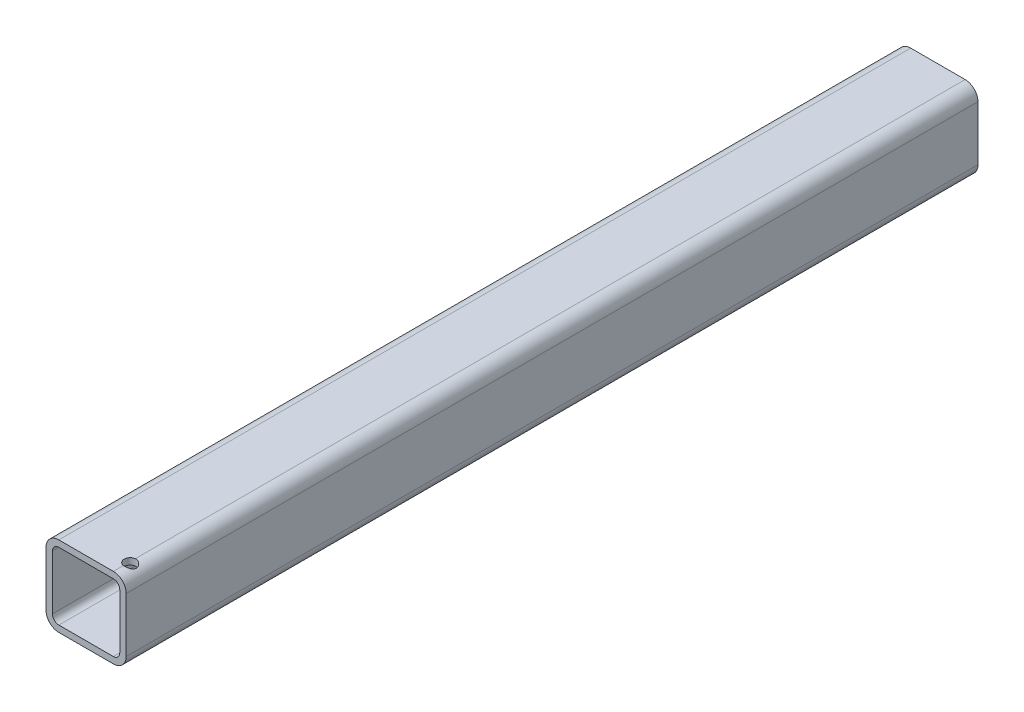
ISO-10303-21;
HEADER;
FILE_DESCRIPTION(('STEP AP214'),'2;1');
FILE_NAME('part.step','',(''),(''),'','','');
FILE_SCHEMA(('AUTOMOTIVE_DESIGN { 1 0 10303 214 1 1 1 1 }'));
ENDSEC;
DATA;
#1=APPLICATION_CONTEXT('core data for automotive mechanical design processes');
#2=APPLICATION_PROTOCOL_DEFINITION('international standard','automotive_design',2000,#1);
#3=PRODUCT_CONTEXT('',#1,'mechanical');
#4=PRODUCT('Part','Part','',(#3));
#5=PRODUCT_RELATED_PRODUCT_CATEGORY('part','',(#4));
#6=PRODUCT_DEFINITION_FORMATION('','',#4);
#7=PRODUCT_DEFINITION_CONTEXT('part definition',#1,'design');
#8=PRODUCT_DEFINITION('design','',#6,#7);
#9=PRODUCT_DEFINITION_SHAPE('','',#8);
#10=(LENGTH_UNIT() NAMED_UNIT(*) SI_UNIT(.MILLI.,.METRE.));
#11=(NAMED_UNIT(*) PLANE_ANGLE_UNIT() SI_UNIT($,.RADIAN.));
#12=(NAMED_UNIT(*) SI_UNIT($,.STERADIAN.) SOLID_ANGLE_UNIT());
#13=UNCERTAINTY_MEASURE_WITH_UNIT(LENGTH_MEASURE(1.E-05),#10,'distance_accuracy_value','');
#14=(GEOMETRIC_REPRESENTATION_CONTEXT(3) GLOBAL_UNCERTAINTY_ASSIGNED_CONTEXT((#13)) GLOBAL_UNIT_ASSIGNED_CONTEXT((#10,
#11,#12)) REPRESENTATION_CONTEXT('',''));
#15=CARTESIAN_POINT('',(0.,0.,0.));
#16=DIRECTION('',(0.,0.,1.));
#17=DIRECTION('',(1.,0.,0.));
#18=AXIS2_PLACEMENT_3D('',#15,#16,#17);
#19=CARTESIAN_POINT('',(1193.6,-1206.4,-880.000000000001));
#20=DIRECTION('',(0.,0.,1.));
#21=DIRECTION('',(1.,0.,0.));
#22=AXIS2_PLACEMENT_3D('',#19,#20,#21);
#23=CYLINDRICAL_SURFACE('',#22,3.19999999999987);
#24=CARTESIAN_POINT('',(1193.6,-1203.2,849.026786250536));
#25=CARTESIAN_POINT('',(1193.66620932112,-1203.1999842709,849.017863230513));
#26=CARTESIAN_POINT('',(1193.73271642675,-1203.20205446071,849.011182596281));
#27=CARTESIAN_POINT('',(1193.8657386283,-1203.21036120763,849.002269009164));
#28=CARTESIAN_POINT('',(1193.93225370696,-1203.21659587799,849.000034043963));
#29=CARTESIAN_POINT('',(1194.06429347108,-1203.23316690178,848.999966936365));
#30=CARTESIAN_POINT('',(1194.1298218362,-1203.24347373356,849.002103557488));
#31=CARTESIAN_POINT('',(1194.25983674047,-1203.26806759426,849.010562628987));
#32=CARTESIAN_POINT('',(1194.32432322687,-1203.28235482408,849.016885290658));
#33=CARTESIAN_POINT('',(1194.51532588333,-1203.33090239494,849.04181521872));
#34=CARTESIAN_POINT('',(1194.63969207312,-1203.37088791289,849.066385954809));
#35=CARTESIAN_POINT('',(1194.87968538173,-1203.46417382354,849.129176743057));
#36=CARTESIAN_POINT('',(1194.99529791584,-1203.51749582709,849.167418992551));
#37=CARTESIAN_POINT('',(1195.25391638054,-1203.65541724377,849.269967357924));
#38=CARTESIAN_POINT('',(1195.39277908891,-1203.74447785389,849.338714367491));
#39=CARTESIAN_POINT('',(1195.65064901229,-1203.93809496542,849.490449552845));
#40=CARTESIAN_POINT('',(1195.7696091084,-1204.04268716358,849.573470606401));
#41=CARTESIAN_POINT('',(1195.95214022795,-1204.22781491835,849.72008045974));
#42=CARTESIAN_POINT('',(1196.02113153144,-1204.30508934378,849.781190496869));
#43=CARTESIAN_POINT('',(1196.15038275712,-1204.46452039217,849.906215325151));
#44=CARTESIAN_POINT('',(1196.21064264156,-1204.54667703623,849.970130128426));
#45=CARTESIAN_POINT('',(1196.32265118066,-1204.71553028981,850.099316841432));
#46=CARTESIAN_POINT('',(1196.37440170651,-1204.80222589569,850.16458844924));
#47=CARTESIAN_POINT('',(1196.46957164095,-1204.98023125443,850.294801119524));
#48=CARTESIAN_POINT('',(1196.5129960184,-1205.07153821398,850.359742356488));
#49=CARTESIAN_POINT('',(1196.59035446715,-1205.25652688437,850.48497326175));
#50=CARTESIAN_POINT('',(1196.62454102063,-1205.35004721596,850.54534472139));
#51=CARTESIAN_POINT('',(1196.68487306557,-1205.54336957949,850.659995709951));
#52=CARTESIAN_POINT('',(1196.71102288934,-1205.64316819197,850.714278510982));
#53=CARTESIAN_POINT('',(1196.74795308368,-1205.82034595039,850.795780970688));
#54=CARTESIAN_POINT('',(1196.7609917835,-1205.89570942567,850.826267764086));
#55=CARTESIAN_POINT('',(1196.78180086415,-1206.05048607527,850.876462229913));
#56=CARTESIAN_POINT('',(1196.78959926205,-1206.12987523262,850.896227115326));
#57=CARTESIAN_POINT('',(1196.79624093164,-1206.24178783805,850.913233911294));
#58=CARTESIAN_POINT('',(1196.79764356947,-1206.27323058813,850.916856136241));
#59=CARTESIAN_POINT('',(1196.79952577223,-1206.33644222942,850.921733367001));
#60=CARTESIAN_POINT('',(1196.80000190522,-1206.36821189664,850.922979571258));
#61=CARTESIAN_POINT('',(1196.8,-1206.4,850.922967038573));
#62=B_SPLINE_CURVE_WITH_KNOTS('',3,(#24,#25,#26,#27,#28,#29,#30,#31,#32,#33,#34,#35,#36,#37,#38,
#39,#40,#41,#42,#43,#44,#45,#46,#47,#48,#49,#50,#51,#52,#53,#54,#55,#56,#57,#58,#59,#60,#61),
.UNSPECIFIED.,.F.,.F.,(4,2,2,2,2,2,2,2,2,2,2,2,2,2,2,2,2,2,4),(0.,0.200346249189459,
0.400601791621769,0.599431437533845,0.798271120380716,1.19503508074588,1.59244618252766,
2.12568925794377,2.66017743562007,3.02056841165416,3.38096094539118,3.7412741232959,
4.10137160032824,4.450305339861,4.79905065105189,5.04544975439357,5.29052078480764,
5.38547313309838,5.4807765376363),.UNSPECIFIED.);
#63=CARTESIAN_POINT('',(1193.6,-1203.2,849.026786250536));
#64=VERTEX_POINT('',#63);
#65=CARTESIAN_POINT('',(1196.8,-1206.4,850.922967038573));
#66=VERTEX_POINT('',#65);
#67=EDGE_CURVE('E195',#64,#66,#62,.T.);
#68=ORIENTED_EDGE('',*,*,#67,.F.);
#69=DIRECTION('',(0.,0.,1.));
#70=VECTOR('',#69,1.);
#71=CARTESIAN_POINT('',(1193.6,-1203.2,-880.000000000001));
#72=LINE('',#71,#70);
#73=CARTESIAN_POINT('',(1193.6,-1203.2,435.));
#74=VERTEX_POINT('',#73);
#75=EDGE_CURVE('E287',#74,#64,#72,.T.);
#76=ORIENTED_EDGE('',*,*,#75,.F.);
#77=CARTESIAN_POINT('',(1193.6,-1206.4,435.));
#78=DIRECTION('',(0.,0.,1.));
#79=DIRECTION('',(1.,0.,0.));
#80=AXIS2_PLACEMENT_3D('',#77,#78,#79);
#81=CIRCLE('',#80,3.19999999999987);
#82=CARTESIAN_POINT('',(1196.8,-1206.4,435.));
#83=VERTEX_POINT('',#82);
#84=EDGE_CURVE('E215',#74,#83,#81,.F.);
#85=ORIENTED_EDGE('',*,*,#84,.T.);
#86=DIRECTION('',(0.,0.,1.));
#87=VECTOR('',#86,1.);
#88=CARTESIAN_POINT('',(1196.8,-1206.4,-880.000000000001));
#89=LINE('',#88,#87);
#90=EDGE_CURVE('E286',#66,#83,#89,.F.);
#91=ORIENTED_EDGE('',*,*,#90,.F.);
#92=EDGE_LOOP('',(#68,#76,#85,#91));
#93=FACE_BOUND('',#92,.T.);
#94=ADVANCED_FACE('F16',(#93),#23,.F.);
#95=CARTESIAN_POINT('',(1196.8,-1206.4,853.077032961427));
#96=CARTESIAN_POINT('',(1196.80000975725,-1206.35649191912,853.076977904457));
#97=CARTESIAN_POINT('',(1196.79911274527,-1206.31304131853,853.079340153122));
#98=CARTESIAN_POINT('',(1196.79559845224,-1206.22682632019,853.088425169337));
#99=CARTESIAN_POINT('',(1196.7929876315,-1206.18405996089,853.095131560098));
#100=CARTESIAN_POINT('',(1196.78285476501,-1206.05890217577,853.120731430081));
#101=CARTESIAN_POINT('',(1196.77302393382,-1205.97782262805,853.145144890022));
#102=CARTESIAN_POINT('',(1196.75053700525,-1205.83586704505,853.197997314719));
#103=CARTESIAN_POINT('',(1196.73881058255,-1205.77414286308,853.22471295204));
#104=CARTESIAN_POINT('',(1196.71228890266,-1205.65335751336,853.282379867236));
#105=CARTESIAN_POINT('',(1196.69749165706,-1205.59429810142,853.313333885104));
#106=CARTESIAN_POINT('',(1196.66484342788,-1205.47780521208,853.378387249168));
#107=CARTESIAN_POINT('',(1196.64695610463,-1205.42040184424,853.412521498987));
#108=CARTESIAN_POINT('',(1196.60837370353,-1205.30764716312,853.482562026696));
#109=CARTESIAN_POINT('',(1196.58767775257,-1205.2522964948,853.518468853403));
#110=CARTESIAN_POINT('',(1196.52549317625,-1205.09888062393,853.621065711078));
#111=CARTESIAN_POINT('',(1196.48083382284,-1205.00287301641,853.688932711131));
#112=CARTESIAN_POINT('',(1196.38241905077,-1204.81592473061,853.825149178094));
#113=CARTESIAN_POINT('',(1196.32865757332,-1204.72498748135,853.893498937118));
#114=CARTESIAN_POINT('',(1196.21210875149,-1204.54851066083,854.028419134489));
#115=CARTESIAN_POINT('',(1196.14936473817,-1204.46294786196,854.094996392561));
#116=CARTESIAN_POINT('',(1196.01444237507,-1204.29717355675,854.225039523954));
#117=CARTESIAN_POINT('',(1195.94227007044,-1204.21695867086,854.288507355393));
#118=CARTESIAN_POINT('',(1195.75953760893,-1204.03382473803,854.433563737396));
#119=CARTESIAN_POINT('',(1195.64466964804,-1203.93352384094,854.51313887678));
#120=CARTESIAN_POINT('',(1195.39634479866,-1203.74723713651,854.659117037007));
#121=CARTESIAN_POINT('',(1195.26290671037,-1203.66123704209,854.725533217047));
#122=CARTESIAN_POINT('',(1195.00557001958,-1203.52223540611,854.829181061504));
#123=CARTESIAN_POINT('',(1194.88466051412,-1203.46606887535,854.869558661143));
#124=CARTESIAN_POINT('',(1194.63323699235,-1203.36841760611,854.935265842734));
#125=CARTESIAN_POINT('',(1194.50274234969,-1203.32690418609,854.960624888252));
#126=CARTESIAN_POINT('',(1194.30684940784,-1203.2783784662,854.984931862962));
#127=CARTESIAN_POINT('',(1194.24383015084,-1203.26477101025,854.990752663502));
#128=CARTESIAN_POINT('',(1194.11683659648,-1203.24135476926,854.998397484813));
#129=CARTESIAN_POINT('',(1194.05286239069,-1203.23154562235,855.000221886393));
#130=CARTESIAN_POINT('',(1193.92401886946,-1203.21578126698,854.999733585524));
#131=CARTESIAN_POINT('',(1193.85914642629,-1203.20985259476,854.997392795943));
#132=CARTESIAN_POINT('',(1193.72942158505,-1203.20195400469,854.988484227468));
#133=CARTESIAN_POINT('',(1193.66456920936,-1203.19998588047,854.98191453517));
#134=CARTESIAN_POINT('',(1193.6,-1203.2,854.973213749464));
#135=B_SPLINE_CURVE_WITH_KNOTS('',3,(#95,#96,#97,#98,#99,#100,#101,#102,#103,#104,#105,#106,
#107,#108,#109,#110,#111,#112,#113,#114,#115,#116,#117,#118,#119,#120,#121,#122,#123,#124,#125,
#126,#127,#128,#129,#130,#131,#132,#133,#134),.UNSPECIFIED.,.F.,.F.,(4,2,2,2,2,2,2,2,2,2,2,2,2,
2,2,2,2,2,2,4),(0.,0.130354585073929,0.260220589825742,0.514569593691118,0.71913243189332,
0.92382814417263,1.13111920045024,1.33847484463474,1.71528091036408,2.09233878801075,
2.46763549750819,2.84269274856531,3.35690170495937,3.87059381851075,4.28687827567049,
4.70234333257934,4.89634698677732,5.09033215397543,5.28563038268798,5.48101703802198),.UNSPECIFIED.);
#136=CARTESIAN_POINT('',(1196.8,-1206.4,853.077032961427));
#137=VERTEX_POINT('',#136);
#138=CARTESIAN_POINT('',(1193.6,-1203.2,854.973213749464));
#139=VERTEX_POINT('',#138);
#140=EDGE_CURVE('E165',#137,#139,#135,.T.);
#141=ORIENTED_EDGE('',*,*,#140,.F.);
#142=CARTESIAN_POINT('',(1196.8,-1206.4,860.));
#143=VERTEX_POINT('',#142);
#144=EDGE_CURVE('E164',#143,#137,#89,.F.);
#145=ORIENTED_EDGE('',*,*,#144,.F.);
#146=CARTESIAN_POINT('',(1193.6,-1206.4,860.));
#147=DIRECTION('',(0.,0.,1.));
#148=DIRECTION('',(1.,0.,0.));
#149=AXIS2_PLACEMENT_3D('',#146,#147,#148);
#150=CIRCLE('',#149,3.19999999999987);
#151=CARTESIAN_POINT('',(1193.6,-1203.2,860.));
#152=VERTEX_POINT('',#151);
#153=EDGE_CURVE('E255',#152,#143,#150,.F.);
#154=ORIENTED_EDGE('',*,*,#153,.F.);
#155=EDGE_CURVE('E290',#139,#152,#72,.T.);
#156=ORIENTED_EDGE('',*,*,#155,.F.);
#157=EDGE_LOOP('',(#141,#145,#154,#156));
#158=FACE_BOUND('',#157,.T.);
#159=ADVANCED_FACE('F374',(#158),#23,.F.);
#160=CARTESIAN_POINT('',(1196.8,-1233.6,-880.000000000001));
#161=DIRECTION('',(-1.,0.,0.));
#162=DIRECTION('',(0.,-1.,0.));
#163=AXIS2_PLACEMENT_3D('',#160,#161,#162);
#164=PLANE('',#163);
#165=DIRECTION('',(0.,0.,-1.));
#166=VECTOR('',#165,1.);
#167=CARTESIAN_POINT('',(1196.8,-1210.,-880.000000000001));
#168=LINE('',#167,#166);
#169=CARTESIAN_POINT('',(1196.8,-1210.,853.077032961427));
#170=VERTEX_POINT('',#169);
#171=CARTESIAN_POINT('',(1196.8,-1210.,850.922967038573));
#172=VERTEX_POINT('',#171);
#173=EDGE_CURVE('E11',#170,#172,#168,.T.);
#174=ORIENTED_EDGE('',*,*,#173,.T.);
#175=DIRECTION('',(0.,-1.,0.));
#176=VECTOR('',#175,1.);
#177=CARTESIAN_POINT('',(1196.8,-745.,850.922967038573));
#178=LINE('',#177,#176);
#179=EDGE_CURVE('E158',#172,#66,#178,.F.);
#180=ORIENTED_EDGE('',*,*,#179,.T.);
#181=ORIENTED_EDGE('',*,*,#90,.T.);
#182=DIRECTION('',(0.,1.,0.));
#183=VECTOR('',#182,1.);
#184=CARTESIAN_POINT('',(1196.8,-1235.4,435.));
#185=LINE('',#184,#183);
#186=CARTESIAN_POINT('',(1196.8,-1233.6,435.));
#187=VERTEX_POINT('',#186);
#188=EDGE_CURVE('E212',#83,#187,#185,.F.);
#189=ORIENTED_EDGE('',*,*,#188,.T.);
#190=DIRECTION('',(0.,0.,1.));
#191=VECTOR('',#190,1.);
#192=CARTESIAN_POINT('',(1196.8,-1233.6,-880.000000000001));
#193=LINE('',#192,#191);
#194=CARTESIAN_POINT('',(1196.8,-1233.6,860.));
#195=VERTEX_POINT('',#194);
#196=EDGE_CURVE('E282',#187,#195,#193,.T.);
#197=ORIENTED_EDGE('',*,*,#196,.T.);
#198=DIRECTION('',(0.,1.,0.));
#199=VECTOR('',#198,1.);
#200=CARTESIAN_POINT('',(1196.8,-1206.4,860.));
#201=LINE('',#200,#199);
#202=EDGE_CURVE('E253',#143,#195,#201,.F.);
#203=ORIENTED_EDGE('',*,*,#202,.F.);
#204=ORIENTED_EDGE('',*,*,#144,.T.);
#205=DIRECTION('',(0.,-1.,0.));
#206=VECTOR('',#205,1.);
#207=CARTESIAN_POINT('',(1196.8,-745.,853.077032961427));
#208=LINE('',#207,#206);
#209=EDGE_CURVE('E156',#137,#170,#208,.T.);
#210=ORIENTED_EDGE('',*,*,#209,.T.);
#211=EDGE_LOOP('',(#174,#180,#181,#189,#197,#203,#204,#210));
#212=FACE_BOUND('',#211,.T.);
#213=ADVANCED_FACE('F161',(#212),#164,.T.);
#214=CARTESIAN_POINT('',(1193.6,-1206.4,-880.000000000001));
#215=DIRECTION('',(0.,0.,1.));
#216=DIRECTION('',(1.,0.,0.));
#217=AXIS2_PLACEMENT_3D('',#214,#215,#216);
#218=CYLINDRICAL_SURFACE('',#217,6.39999999999996);
#219=DIRECTION('',(0.,0.,1.));
#220=VECTOR('',#219,1.);
#221=CARTESIAN_POINT('',(1193.6,-1200.,-880.000000000001));
#222=LINE('',#221,#220);
#223=CARTESIAN_POINT('',(1193.6,-1200.,435.));
#224=VERTEX_POINT('',#223);
#225=CARTESIAN_POINT('',(1193.6,-1200.,849.026786250536));
#226=VERTEX_POINT('',#225);
#227=EDGE_CURVE('E242',#224,#226,#222,.T.);
#228=ORIENTED_EDGE('',*,*,#227,.T.);
#229=CARTESIAN_POINT('',(1193.6,-1200.,849.026786250536));
#230=CARTESIAN_POINT('',(1193.67819963284,-1199.99998680551,849.016253378908));
#231=CARTESIAN_POINT('',(1193.75681301825,-1200.00143291347,849.00883029324));
#232=CARTESIAN_POINT('',(1193.91425259596,-1200.0072381012,849.000192976679));
#233=CARTESIAN_POINT('',(1193.99307872658,-1200.01159641184,848.998977107112));
#234=CARTESIAN_POINT('',(1194.15005455485,-1200.0231969838,849.002730390493));
#235=CARTESIAN_POINT('',(1194.22820569805,-1200.03042757,849.007674675594));
#236=CARTESIAN_POINT('',(1194.38356171304,-1200.04766562412,849.023595087985));
#237=CARTESIAN_POINT('',(1194.4607665637,-1200.05767315394,849.034571349764));
#238=CARTESIAN_POINT('',(1194.69005854621,-1200.0916299009,849.076323289101));
#239=CARTESIAN_POINT('',(1194.84005812921,-1200.11953118753,849.1159284055));
#240=CARTESIAN_POINT('',(1195.13053878312,-1200.18391757282,849.216907584853));
#241=CARTESIAN_POINT('',(1195.27101259469,-1200.22040912528,849.278298032618));
#242=CARTESIAN_POINT('',(1195.54621998598,-1200.30133069995,849.424225785717));
#243=CARTESIAN_POINT('',(1195.68034745487,-1200.34605928155,849.509738889701));
#244=CARTESIAN_POINT('',(1195.93282292561,-1200.43878665143,849.700167182546));
#245=CARTESIAN_POINT('',(1196.051160809,-1200.48678750721,849.805094710978));
#246=CARTESIAN_POINT('',(1196.28064730267,-1200.58697365739,850.043318260197));
#247=CARTESIAN_POINT('',(1196.38999081455,-1200.63911417118,850.178377241175));
#248=CARTESIAN_POINT('',(1196.58461458652,-1200.73749174168,850.467028731662));
#249=CARTESIAN_POINT('',(1196.66989191021,-1200.78372807763,850.620623499515));
#250=CARTESIAN_POINT('',(1196.77684605295,-1200.84398530065,850.861255296663));
#251=CARTESIAN_POINT('',(1196.80888443298,-1200.86247788349,850.942698735273));
#252=CARTESIAN_POINT('',(1196.86588552342,-1200.89590294115,851.108715634963));
#253=CARTESIAN_POINT('',(1196.89085221952,-1200.91083742062,851.193287302419));
#254=CARTESIAN_POINT('',(1196.93331152558,-1200.93651656695,851.364798457377));
#255=CARTESIAN_POINT('',(1196.95081327669,-1200.94726635675,851.451734909446));
#256=CARTESIAN_POINT('',(1196.97807707545,-1200.96411414238,851.627255213176));
#257=CARTESIAN_POINT('',(1196.98784061056,-1200.97021303222,851.715838744881));
#258=CARTESIAN_POINT('',(1196.99861408461,-1200.97695163865,851.881022722217));
#259=CARTESIAN_POINT('',(1197.00067396207,-1200.97824594778,851.957530152901));
#260=CARTESIAN_POINT('',(1196.99894059038,-1200.97715899558,852.110478833258));
#261=CARTESIAN_POINT('',(1196.99514551235,-1200.97477658578,852.186920054786));
#262=CARTESIAN_POINT('',(1196.9817544563,-1200.96641929891,852.339071167859));
#263=CARTESIAN_POINT('',(1196.97216025407,-1200.96044552158,852.414781276074));
#264=CARTESIAN_POINT('',(1196.94731315016,-1200.94512116733,852.56493022428));
#265=CARTESIAN_POINT('',(1196.9320580068,-1200.93576925274,852.639368548423));
#266=CARTESIAN_POINT('',(1196.88003211932,-1200.90427449946,852.851978616068));
#267=CARTESIAN_POINT('',(1196.8361964791,-1200.87815565623,852.987905756417));
#268=CARTESIAN_POINT('',(1196.73062186692,-1200.81762784134,853.250516351857));
#269=CARTESIAN_POINT('',(1196.66887774692,-1200.78321648638,853.377197135832));
#270=CARTESIAN_POINT('',(1196.52096123889,-1200.70475842104,853.633755617671));
#271=CARTESIAN_POINT('',(1196.43277578275,-1200.66005540323,853.762272754726));
#272=CARTESIAN_POINT('',(1196.23816173528,-1200.56804576061,854.003672377652));
#273=CARTESIAN_POINT('',(1196.13171992221,-1200.52073726584,854.11654342434));
#274=CARTESIAN_POINT('',(1195.88853445657,-1200.42154914935,854.337433167327));
#275=CARTESIAN_POINT('',(1195.749681743,-1200.36981051695,854.443205397736));
#276=CARTESIAN_POINT('',(1195.45402269376,-1200.27246145445,854.629888123971));
#277=CARTESIAN_POINT('',(1195.29721609801,-1200.22685111312,854.710798259576));
#278=CARTESIAN_POINT('',(1195.05302402502,-1200.16656959876,854.810468085302));
#279=CARTESIAN_POINT('',(1194.97083427747,-1200.14795094798,854.839921207682));
#280=CARTESIAN_POINT('',(1194.80365684132,-1200.11362827825,854.89167379568));
#281=CARTESIAN_POINT('',(1194.71867058201,-1200.09792279681,854.913976854946));
#282=CARTESIAN_POINT('',(1194.54666136581,-1200.06980092576,854.951083679122));
#283=CARTESIAN_POINT('',(1194.45964116204,-1200.05738034188,854.965897029417));
#284=CARTESIAN_POINT('',(1194.28424532208,-1200.03606959428,854.987810462644));
#285=CARTESIAN_POINT('',(1194.19587038862,-1200.0271776605,854.994914415905));
#286=CARTESIAN_POINT('',(1194.02266022304,-1200.01340958426,855.001106091609));
#287=CARTESIAN_POINT('',(1193.93785086866,-1200.00836635429,855.000550239218));
#288=CARTESIAN_POINT('',(1193.76853541111,-1200.00165425474,854.992261366149));
#289=CARTESIAN_POINT('',(1193.68402908982,-1199.99998202423,854.984535505322));
#290=CARTESIAN_POINT('',(1193.6,-1200.,854.973213749464));
#291=B_SPLINE_CURVE_WITH_KNOTS('',3,(#229,#230,#231,#232,#233,#234,#235,#236,#237,#238,#239,
#240,#241,#242,#243,#244,#245,#246,#247,#248,#249,#250,#251,#252,#253,#254,#255,#256,#257,#258,
#259,#260,#261,#262,#263,#264,#265,#266,#267,#268,#269,#270,#271,#272,#273,#274,#275,#276,#277,
#278,#279,#280,#281,#282,#283,#284,#285,#286,#287,#288,#289,#290),.UNSPECIFIED.,.F.,.F.,(4,2,2,
2,2,2,2,2,2,2,2,2,2,2,2,2,2,2,2,2,2,2,2,2,2,2,2,2,2,2,4),(0.,0.236633858176166,0.47320524294034,
0.708824702584138,0.944449415767854,1.4150005113405,1.88590626246263,2.37958473715969,
2.87357807249905,3.4153952535362,3.95727851468552,4.22529831819561,4.49316676026505,
4.76070623732625,5.02819427504094,5.25752889028156,5.48693515610299,5.7162712098299,
5.94569817609626,6.37933098803909,6.81308857736806,7.29760345495907,7.78247072396151,
8.32610915231289,8.86975545695923,9.13725653104721,9.40462294651947,9.67164631276838,
9.93853556389711,10.1930496212096,10.4473097981923),.UNSPECIFIED.);
#292=CARTESIAN_POINT('',(1193.6,-1200.,854.973213749464));
#293=VERTEX_POINT('',#292);
#294=EDGE_CURVE('E24',#226,#293,#291,.T.);
#295=ORIENTED_EDGE('',*,*,#294,.T.);
#296=CARTESIAN_POINT('',(1193.6,-1200.,860.));
#297=VERTEX_POINT('',#296);
#298=EDGE_CURVE('E245',#293,#297,#222,.T.);
#299=ORIENTED_EDGE('',*,*,#298,.T.);
#300=CARTESIAN_POINT('',(1193.6,-1206.4,860.));
#301=DIRECTION('',(0.,0.,1.));
#302=DIRECTION('',(1.,0.,0.));
#303=AXIS2_PLACEMENT_3D('',#300,#301,#302);
#304=CIRCLE('',#303,6.39999999999996);
#305=CARTESIAN_POINT('',(1200.,-1206.4,860.));
#306=VERTEX_POINT('',#305);
#307=EDGE_CURVE('E251',#297,#306,#304,.F.);
#308=ORIENTED_EDGE('',*,*,#307,.T.);
#309=DIRECTION('',(0.,0.,1.));
#310=VECTOR('',#309,1.);
#311=CARTESIAN_POINT('',(1200.,-1206.4,-880.000000000001));
#312=LINE('',#311,#310);
#313=CARTESIAN_POINT('',(1200.,-1206.4,435.));
#314=VERTEX_POINT('',#313);
#315=EDGE_CURVE('E233',#306,#314,#312,.F.);
#316=ORIENTED_EDGE('',*,*,#315,.T.);
#317=CARTESIAN_POINT('',(1193.6,-1206.4,435.));
#318=DIRECTION('',(0.,0.,1.));
#319=DIRECTION('',(1.,0.,0.));
#320=AXIS2_PLACEMENT_3D('',#317,#318,#319);
#321=CIRCLE('',#320,6.39999999999996);
#322=EDGE_CURVE('E232',#314,#224,#321,.T.);
#323=ORIENTED_EDGE('',*,*,#322,.T.);
#324=EDGE_LOOP('',(#228,#295,#299,#308,#316,#323));
#325=FACE_BOUND('',#324,.T.);
#326=ADVANCED_FACE('F357',(#325),#218,.T.);
#327=CARTESIAN_POINT('',(1166.4,-1200.,-880.000000000001));
#328=DIRECTION('',(0.,-1.,0.));
#329=DIRECTION('',(1.,0.,0.));
#330=AXIS2_PLACEMENT_3D('',#327,#328,#329);
#331=PLANE('',#330);
#332=CARTESIAN_POINT('',(1194.,-1200.,852.));
#333=DIRECTION('',(0.,-1.,0.));
#334=DIRECTION('',(1.,0.,0.));
#335=AXIS2_PLACEMENT_3D('',#332,#333,#334);
#336=CIRCLE('',#335,2.99999999999994);
#337=EDGE_CURVE('E37',#226,#293,#336,.F.);
#338=ORIENTED_EDGE('',*,*,#337,.F.);
#339=ORIENTED_EDGE('',*,*,#227,.F.);
#340=DIRECTION('',(1.,0.,0.));
#341=VECTOR('',#340,1.);
#342=CARTESIAN_POINT('',(1164.6,-1200.,435.));
#343=LINE('',#342,#341);
#344=CARTESIAN_POINT('',(1166.4,-1200.,435.));
#345=VERTEX_POINT('',#344);
#346=EDGE_CURVE('E229',#224,#345,#343,.F.);
#347=ORIENTED_EDGE('',*,*,#346,.T.);
#348=DIRECTION('',(0.,0.,1.));
#349=VECTOR('',#348,1.);
#350=CARTESIAN_POINT('',(1166.4,-1200.,-880.));
#351=LINE('',#350,#349);
#352=CARTESIAN_POINT('',(1166.4,-1200.,860.));
#353=VERTEX_POINT('',#352);
#354=EDGE_CURVE('E202',#353,#345,#351,.F.);
#355=ORIENTED_EDGE('',*,*,#354,.F.);
#356=DIRECTION('',(1.,0.,0.));
#357=VECTOR('',#356,1.);
#358=CARTESIAN_POINT('',(1180.,-1200.,860.));
#359=LINE('',#358,#357);
#360=EDGE_CURVE('E271',#297,#353,#359,.F.);
#361=ORIENTED_EDGE('',*,*,#360,.F.);
#362=ORIENTED_EDGE('',*,*,#298,.F.);
#363=EDGE_LOOP('',(#338,#339,#347,#355,#361,#362));
#364=FACE_BOUND('',#363,.T.);
#365=ADVANCED_FACE('F18',(#364),#331,.F.);
#366=CARTESIAN_POINT('',(1166.4,-1206.4,-880.));
#367=DIRECTION('',(0.,0.,1.));
#368=DIRECTION('',(1.,0.,0.));
#369=AXIS2_PLACEMENT_3D('',#366,#367,#368);
#370=CYLINDRICAL_SURFACE('',#369,6.39999999999996);
#371=ORIENTED_EDGE('',*,*,#354,.T.);
#372=CARTESIAN_POINT('',(1166.4,-1206.4,435.));
#373=DIRECTION('',(0.,0.,1.));
#374=DIRECTION('',(1.,0.,0.));
#375=AXIS2_PLACEMENT_3D('',#372,#373,#374);
#376=CIRCLE('',#375,6.39999999999996);
#377=CARTESIAN_POINT('',(1160.,-1206.4,435.));
#378=VERTEX_POINT('',#377);
#379=EDGE_CURVE('E228',#345,#378,#376,.T.);
#380=ORIENTED_EDGE('',*,*,#379,.T.);
#381=DIRECTION('',(0.,0.,1.));
#382=VECTOR('',#381,1.);
#383=CARTESIAN_POINT('',(1160.,-1206.4,-880.000000000001));
#384=LINE('',#383,#382);
#385=CARTESIAN_POINT('',(1160.,-1206.4,860.));
#386=VERTEX_POINT('',#385);
#387=EDGE_CURVE('E299',#378,#386,#384,.T.);
#388=ORIENTED_EDGE('',*,*,#387,.T.);
#389=CARTESIAN_POINT('',(1166.4,-1206.4,860.));
#390=DIRECTION('',(0.,0.,1.));
#391=DIRECTION('',(1.,0.,0.));
#392=AXIS2_PLACEMENT_3D('',#389,#390,#391);
#393=CIRCLE('',#392,6.39999999999996);
#394=EDGE_CURVE('E270',#353,#386,#393,.T.);
#395=ORIENTED_EDGE('',*,*,#394,.F.);
#396=EDGE_LOOP('',(#371,#380,#388,#395));
#397=FACE_BOUND('',#396,.T.);
#398=ADVANCED_FACE('F334',(#397),#370,.T.);
#399=CARTESIAN_POINT('',(1160.,-1206.4,-880.000000000001));
#400=DIRECTION('',(1.,0.,0.));
#401=DIRECTION('',(0.,1.,0.));
#402=AXIS2_PLACEMENT_3D('',#399,#400,#401);
#403=PLANE('',#402);
#404=DIRECTION('',(0.,0.,1.));
#405=VECTOR('',#404,1.);
#406=CARTESIAN_POINT('',(1160.,-1233.6,-880.000000000001));
#407=LINE('',#406,#405);
#408=CARTESIAN_POINT('',(1160.,-1233.6,860.));
#409=VERTEX_POINT('',#408);
#410=CARTESIAN_POINT('',(1160.,-1233.6,435.));
#411=VERTEX_POINT('',#410);
#412=EDGE_CURVE('E297',#409,#411,#407,.F.);
#413=ORIENTED_EDGE('',*,*,#412,.F.);
#414=DIRECTION('',(0.,1.,0.));
#415=VECTOR('',#414,1.);
#416=CARTESIAN_POINT('',(1160.,-1206.4,860.));
#417=LINE('',#416,#415);
#418=EDGE_CURVE('E268',#386,#409,#417,.F.);
#419=ORIENTED_EDGE('',*,*,#418,.F.);
#420=ORIENTED_EDGE('',*,*,#387,.F.);
#421=DIRECTION('',(0.,1.,0.));
#422=VECTOR('',#421,1.);
#423=CARTESIAN_POINT('',(1160.,-1235.4,435.));
#424=LINE('',#423,#422);
#425=EDGE_CURVE('E225',#378,#411,#424,.F.);
#426=ORIENTED_EDGE('',*,*,#425,.T.);
#427=EDGE_LOOP('',(#413,#419,#420,#426));
#428=FACE_BOUND('',#427,.T.);
#429=ADVANCED_FACE('F338',(#428),#403,.F.);
#430=CARTESIAN_POINT('',(1166.4,-1233.6,-880.000000000001));
#431=DIRECTION('',(0.,0.,1.));
#432=DIRECTION('',(1.,0.,0.));
#433=AXIS2_PLACEMENT_3D('',#430,#431,#432);
#434=CYLINDRICAL_SURFACE('',#433,6.39999999999996);
#435=ORIENTED_EDGE('',*,*,#412,.T.);
#436=CARTESIAN_POINT('',(1166.4,-1233.6,435.));
#437=DIRECTION('',(0.,0.,1.));
#438=DIRECTION('',(1.,0.,0.));
#439=AXIS2_PLACEMENT_3D('',#436,#437,#438);
#440=CIRCLE('',#439,6.39999999999996);
#441=CARTESIAN_POINT('',(1166.4,-1240.,435.));
#442=VERTEX_POINT('',#441);
#443=EDGE_CURVE('E224',#411,#442,#440,.T.);
#444=ORIENTED_EDGE('',*,*,#443,.T.);
#445=DIRECTION('',(0.,0.,1.));
#446=VECTOR('',#445,1.);
#447=CARTESIAN_POINT('',(1166.4,-1240.,-880.000000000001));
#448=LINE('',#447,#446);
#449=CARTESIAN_POINT('',(1166.4,-1240.,860.));
#450=VERTEX_POINT('',#449);
#451=EDGE_CURVE('E293',#442,#450,#448,.T.);
#452=ORIENTED_EDGE('',*,*,#451,.T.);
#453=CARTESIAN_POINT('',(1166.4,-1233.6,860.));
#454=DIRECTION('',(0.,0.,1.));
#455=DIRECTION('',(1.,0.,0.));
#456=AXIS2_PLACEMENT_3D('',#453,#454,#455);
#457=CIRCLE('',#456,6.39999999999996);
#458=EDGE_CURVE('E267',#409,#450,#457,.T.);
#459=ORIENTED_EDGE('',*,*,#458,.F.);
#460=EDGE_LOOP('',(#435,#444,#452,#459));
#461=FACE_BOUND('',#460,.T.);
#462=ADVANCED_FACE('F342',(#461),#434,.T.);
#463=CARTESIAN_POINT('',(1193.6,-1240.,-880.000000000001));
#464=DIRECTION('',(0.,1.,0.));
#465=DIRECTION('',(-1.,0.,0.));
#466=AXIS2_PLACEMENT_3D('',#463,#464,#465);
#467=PLANE('',#466);
#468=DIRECTION('',(0.,0.,1.));
#469=VECTOR('',#468,1.);
#470=CARTESIAN_POINT('',(1193.6,-1240.,-880.000000000001));
#471=LINE('',#470,#469);
#472=CARTESIAN_POINT('',(1193.6,-1240.,860.));
#473=VERTEX_POINT('',#472);
#474=CARTESIAN_POINT('',(1193.6,-1240.,435.));
#475=VERTEX_POINT('',#474);
#476=EDGE_CURVE('E273',#473,#475,#471,.F.);
#477=ORIENTED_EDGE('',*,*,#476,.F.);
#478=DIRECTION('',(1.,0.,0.));
#479=VECTOR('',#478,1.);
#480=CARTESIAN_POINT('',(1180.,-1240.,860.));
#481=LINE('',#480,#479);
#482=EDGE_CURVE('E264',#450,#473,#481,.T.);
#483=ORIENTED_EDGE('',*,*,#482,.F.);
#484=ORIENTED_EDGE('',*,*,#451,.F.);
#485=DIRECTION('',(1.,0.,0.));
#486=VECTOR('',#485,1.);
#487=CARTESIAN_POINT('',(1164.6,-1240.,435.));
#488=LINE('',#487,#486);
#489=EDGE_CURVE('E220',#442,#475,#488,.T.);
#490=ORIENTED_EDGE('',*,*,#489,.T.);
#491=EDGE_LOOP('',(#477,#483,#484,#490));
#492=FACE_BOUND('',#491,.T.);
#493=ADVANCED_FACE('F348',(#492),#467,.F.);
#494=CARTESIAN_POINT('',(1166.4,-1206.4,-880.));
#495=DIRECTION('',(0.,0.,1.));
#496=DIRECTION('',(1.,0.,0.));
#497=AXIS2_PLACEMENT_3D('',#494,#495,#496);
#498=CYLINDRICAL_SURFACE('',#497,3.19999999999987);
#499=CARTESIAN_POINT('',(1166.4,-1206.4,860.));
#500=DIRECTION('',(0.,0.,1.));
#501=DIRECTION('',(1.,0.,0.));
#502=AXIS2_PLACEMENT_3D('',#499,#500,#501);
#503=CIRCLE('',#502,3.19999999999987);
#504=CARTESIAN_POINT('',(1163.2,-1206.4,860.));
#505=VERTEX_POINT('',#504);
#506=CARTESIAN_POINT('',(1166.4,-1203.2,860.));
#507=VERTEX_POINT('',#506);
#508=EDGE_CURVE('E259',#505,#507,#503,.F.);
#509=ORIENTED_EDGE('',*,*,#508,.F.);
#510=DIRECTION('',(0.,0.,1.));
#511=VECTOR('',#510,1.);
#512=CARTESIAN_POINT('',(1163.2,-1206.4,-880.000000000001));
#513=LINE('',#512,#511);
#514=CARTESIAN_POINT('',(1163.2,-1206.4,435.));
#515=VERTEX_POINT('',#514);
#516=EDGE_CURVE('E276',#515,#505,#513,.T.);
#517=ORIENTED_EDGE('',*,*,#516,.F.);
#518=CARTESIAN_POINT('',(1166.4,-1206.4,435.));
#519=DIRECTION('',(0.,0.,1.));
#520=DIRECTION('',(1.,0.,0.));
#521=AXIS2_PLACEMENT_3D('',#518,#519,#520);
#522=CIRCLE('',#521,3.19999999999987);
#523=CARTESIAN_POINT('',(1166.4,-1203.2,435.));
#524=VERTEX_POINT('',#523);
#525=EDGE_CURVE('E219',#515,#524,#522,.F.);
#526=ORIENTED_EDGE('',*,*,#525,.T.);
#527=DIRECTION('',(0.,0.,1.));
#528=VECTOR('',#527,1.);
#529=CARTESIAN_POINT('',(1166.4,-1203.2,-880.000000000001));
#530=LINE('',#529,#528);
#531=EDGE_CURVE('E291',#507,#524,#530,.F.);
#532=ORIENTED_EDGE('',*,*,#531,.F.);
#533=EDGE_LOOP('',(#509,#517,#526,#532));
#534=FACE_BOUND('',#533,.T.);
#535=ADVANCED_FACE('F395',(#534),#498,.F.);
#536=CARTESIAN_POINT('',(1166.4,-1203.2,-880.000000000001));
#537=DIRECTION('',(0.,-1.,0.));
#538=DIRECTION('',(1.,0.,0.));
#539=AXIS2_PLACEMENT_3D('',#536,#537,#538);
#540=PLANE('',#539);
#541=ORIENTED_EDGE('',*,*,#75,.T.);
#542=CARTESIAN_POINT('',(1194.,-1203.2,852.));
#543=DIRECTION('',(0.,-1.,0.));
#544=DIRECTION('',(1.,0.,0.));
#545=AXIS2_PLACEMENT_3D('',#542,#543,#544);
#546=CIRCLE('',#545,2.99999999999994);
#547=EDGE_CURVE('E167',#64,#139,#546,.F.);
#548=ORIENTED_EDGE('',*,*,#547,.T.);
#549=ORIENTED_EDGE('',*,*,#155,.T.);
#550=DIRECTION('',(1.,0.,0.));
#551=VECTOR('',#550,1.);
#552=CARTESIAN_POINT('',(1180.,-1203.2,860.));
#553=LINE('',#552,#551);
#554=EDGE_CURVE('E256',#507,#152,#553,.T.);
#555=ORIENTED_EDGE('',*,*,#554,.F.);
#556=ORIENTED_EDGE('',*,*,#531,.T.);
#557=DIRECTION('',(1.,0.,0.));
#558=VECTOR('',#557,1.);
#559=CARTESIAN_POINT('',(1164.6,-1203.2,435.));
#560=LINE('',#559,#558);
#561=EDGE_CURVE('E216',#524,#74,#560,.T.);
#562=ORIENTED_EDGE('',*,*,#561,.T.);
#563=EDGE_LOOP('',(#541,#548,#549,#555,#556,#562));
#564=FACE_BOUND('',#563,.T.);
#565=ADVANCED_FACE('F385',(#564),#540,.T.);
#566=CARTESIAN_POINT('',(1193.6,-1233.6,-880.000000000001));
#567=DIRECTION('',(0.,0.,1.));
#568=DIRECTION('',(1.,0.,0.));
#569=AXIS2_PLACEMENT_3D('',#566,#567,#568);
#570=CYLINDRICAL_SURFACE('',#569,3.19999999999987);
#571=CARTESIAN_POINT('',(1193.6,-1233.6,860.));
#572=DIRECTION('',(0.,0.,1.));
#573=DIRECTION('',(1.,0.,0.));
#574=AXIS2_PLACEMENT_3D('',#571,#572,#573);
#575=CIRCLE('',#574,3.19999999999987);
#576=CARTESIAN_POINT('',(1193.6,-1236.8,860.));
#577=VERTEX_POINT('',#576);
#578=EDGE_CURVE('E252',#195,#577,#575,.F.);
#579=ORIENTED_EDGE('',*,*,#578,.F.);
#580=ORIENTED_EDGE('',*,*,#196,.F.);
#581=CARTESIAN_POINT('',(1193.6,-1233.6,435.));
#582=DIRECTION('',(0.,0.,1.));
#583=DIRECTION('',(1.,0.,0.));
#584=AXIS2_PLACEMENT_3D('',#581,#582,#583);
#585=CIRCLE('',#584,3.19999999999987);
#586=CARTESIAN_POINT('',(1193.6,-1236.8,435.));
#587=VERTEX_POINT('',#586);
#588=EDGE_CURVE('E211',#187,#587,#585,.F.);
#589=ORIENTED_EDGE('',*,*,#588,.T.);
#590=DIRECTION('',(0.,0.,1.));
#591=VECTOR('',#590,1.);
#592=CARTESIAN_POINT('',(1193.6,-1236.8,-880.000000000001));
#593=LINE('',#592,#591);
#594=EDGE_CURVE('E280',#577,#587,#593,.F.);
#595=ORIENTED_EDGE('',*,*,#594,.F.);
#596=EDGE_LOOP('',(#579,#580,#589,#595));
#597=FACE_BOUND('',#596,.T.);
#598=ADVANCED_FACE('F410',(#597),#570,.F.);
#599=CARTESIAN_POINT('',(1193.6,-1236.8,-880.000000000001));
#600=DIRECTION('',(0.,1.,0.));
#601=DIRECTION('',(-1.,0.,0.));
#602=AXIS2_PLACEMENT_3D('',#599,#600,#601);
#603=PLANE('',#602);
#604=DIRECTION('',(1.,0.,0.));
#605=VECTOR('',#604,1.);
#606=CARTESIAN_POINT('',(1164.6,-1236.8,435.));
#607=LINE('',#606,#605);
#608=CARTESIAN_POINT('',(1166.4,-1236.8,435.));
#609=VERTEX_POINT('',#608);
#610=EDGE_CURVE('E208',#587,#609,#607,.F.);
#611=ORIENTED_EDGE('',*,*,#610,.T.);
#612=DIRECTION('',(0.,0.,1.));
#613=VECTOR('',#612,1.);
#614=CARTESIAN_POINT('',(1166.4,-1236.8,-880.000000000001));
#615=LINE('',#614,#613);
#616=CARTESIAN_POINT('',(1166.4,-1236.8,860.));
#617=VERTEX_POINT('',#616);
#618=EDGE_CURVE('E277',#609,#617,#615,.T.);
#619=ORIENTED_EDGE('',*,*,#618,.T.);
#620=DIRECTION('',(1.,0.,0.));
#621=VECTOR('',#620,1.);
#622=CARTESIAN_POINT('',(1180.,-1236.8,860.));
#623=LINE('',#622,#621);
#624=EDGE_CURVE('E248',#577,#617,#623,.F.);
#625=ORIENTED_EDGE('',*,*,#624,.F.);
#626=ORIENTED_EDGE('',*,*,#594,.T.);
#627=EDGE_LOOP('',(#611,#619,#625,#626));
#628=FACE_BOUND('',#627,.T.);
#629=ADVANCED_FACE('F406',(#628),#603,.T.);
#630=CARTESIAN_POINT('',(1166.4,-1233.6,-880.000000000001));
#631=DIRECTION('',(0.,0.,1.));
#632=DIRECTION('',(1.,0.,0.));
#633=AXIS2_PLACEMENT_3D('',#630,#631,#632);
#634=CYLINDRICAL_SURFACE('',#633,3.19999999999987);
#635=CARTESIAN_POINT('',(1166.4,-1233.6,860.));
#636=DIRECTION('',(0.,0.,1.));
#637=DIRECTION('',(1.,0.,0.));
#638=AXIS2_PLACEMENT_3D('',#635,#636,#637);
#639=CIRCLE('',#638,3.19999999999987);
#640=CARTESIAN_POINT('',(1163.2,-1233.6,860.));
#641=VERTEX_POINT('',#640);
#642=EDGE_CURVE('E263',#617,#641,#639,.F.);
#643=ORIENTED_EDGE('',*,*,#642,.F.);
#644=ORIENTED_EDGE('',*,*,#618,.F.);
#645=CARTESIAN_POINT('',(1166.4,-1233.6,435.));
#646=DIRECTION('',(0.,0.,1.));
#647=DIRECTION('',(1.,0.,0.));
#648=AXIS2_PLACEMENT_3D('',#645,#646,#647);
#649=CIRCLE('',#648,3.19999999999987);
#650=CARTESIAN_POINT('',(1163.2,-1233.6,435.));
#651=VERTEX_POINT('',#650);
#652=EDGE_CURVE('E207',#609,#651,#649,.F.);
#653=ORIENTED_EDGE('',*,*,#652,.T.);
#654=DIRECTION('',(0.,0.,1.));
#655=VECTOR('',#654,1.);
#656=CARTESIAN_POINT('',(1163.2,-1233.6,-880.000000000001));
#657=LINE('',#656,#655);
#658=EDGE_CURVE('E274',#641,#651,#657,.F.);
#659=ORIENTED_EDGE('',*,*,#658,.F.);
#660=EDGE_LOOP('',(#643,#644,#653,#659));
#661=FACE_BOUND('',#660,.T.);
#662=ADVANCED_FACE('F403',(#661),#634,.F.);
#663=CARTESIAN_POINT('',(1163.2,-1206.4,-880.000000000001));
#664=DIRECTION('',(1.,0.,0.));
#665=DIRECTION('',(0.,1.,0.));
#666=AXIS2_PLACEMENT_3D('',#663,#664,#665);
#667=PLANE('',#666);
#668=DIRECTION('',(0.,1.,0.));
#669=VECTOR('',#668,1.);
#670=CARTESIAN_POINT('',(1163.2,-1235.4,435.));
#671=LINE('',#670,#669);
#672=EDGE_CURVE('E203',#651,#515,#671,.T.);
#673=ORIENTED_EDGE('',*,*,#672,.T.);
#674=ORIENTED_EDGE('',*,*,#516,.T.);
#675=DIRECTION('',(0.,1.,0.));
#676=VECTOR('',#675,1.);
#677=CARTESIAN_POINT('',(1163.2,-1206.4,860.));
#678=LINE('',#677,#676);
#679=EDGE_CURVE('E260',#641,#505,#678,.T.);
#680=ORIENTED_EDGE('',*,*,#679,.F.);
#681=ORIENTED_EDGE('',*,*,#658,.T.);
#682=EDGE_LOOP('',(#673,#674,#680,#681));
#683=FACE_BOUND('',#682,.T.);
#684=ADVANCED_FACE('F398',(#683),#667,.T.);
#685=CARTESIAN_POINT('',(1193.6,-1233.6,-880.000000000001));
#686=DIRECTION('',(0.,0.,1.));
#687=DIRECTION('',(1.,0.,0.));
#688=AXIS2_PLACEMENT_3D('',#685,#686,#687);
#689=CYLINDRICAL_SURFACE('',#688,6.39999999999996);
#690=ORIENTED_EDGE('',*,*,#476,.T.);
#691=CARTESIAN_POINT('',(1193.6,-1233.6,435.));
#692=DIRECTION('',(0.,0.,1.));
#693=DIRECTION('',(1.,0.,0.));
#694=AXIS2_PLACEMENT_3D('',#691,#692,#693);
#695=CIRCLE('',#694,6.39999999999996);
#696=CARTESIAN_POINT('',(1200.,-1233.6,435.));
#697=VERTEX_POINT('',#696);
#698=EDGE_CURVE('E223',#475,#697,#695,.T.);
#699=ORIENTED_EDGE('',*,*,#698,.T.);
#700=DIRECTION('',(0.,0.,1.));
#701=VECTOR('',#700,1.);
#702=CARTESIAN_POINT('',(1200.,-1233.6,-880.000000000001));
#703=LINE('',#702,#701);
#704=CARTESIAN_POINT('',(1200.,-1233.6,860.));
#705=VERTEX_POINT('',#704);
#706=EDGE_CURVE('E206',#697,#705,#703,.T.);
#707=ORIENTED_EDGE('',*,*,#706,.T.);
#708=CARTESIAN_POINT('',(1193.6,-1233.6,860.));
#709=DIRECTION('',(0.,0.,1.));
#710=DIRECTION('',(1.,0.,0.));
#711=AXIS2_PLACEMENT_3D('',#708,#709,#710);
#712=CIRCLE('',#711,6.39999999999996);
#713=EDGE_CURVE('E266',#473,#705,#712,.T.);
#714=ORIENTED_EDGE('',*,*,#713,.F.);
#715=EDGE_LOOP('',(#690,#699,#707,#714));
#716=FACE_BOUND('',#715,.T.);
#717=ADVANCED_FACE('F352',(#716),#689,.T.);
#718=CARTESIAN_POINT('',(1180.,-1206.4,860.));
#719=DIRECTION('',(0.,0.,1.));
#720=DIRECTION('',(1.,0.,0.));
#721=AXIS2_PLACEMENT_3D('',#718,#719,#720);
#722=PLANE('',#721);
#723=ORIENTED_EDGE('',*,*,#578,.T.);
#724=ORIENTED_EDGE('',*,*,#624,.T.);
#725=ORIENTED_EDGE('',*,*,#642,.T.);
#726=ORIENTED_EDGE('',*,*,#679,.T.);
#727=ORIENTED_EDGE('',*,*,#508,.T.);
#728=ORIENTED_EDGE('',*,*,#554,.T.);
#729=ORIENTED_EDGE('',*,*,#153,.T.);
#730=ORIENTED_EDGE('',*,*,#202,.T.);
#731=EDGE_LOOP('',(#723,#724,#725,#726,#727,#728,#729,#730));
#732=FACE_BOUND('',#731,.T.);
#733=ORIENTED_EDGE('',*,*,#713,.T.);
#734=DIRECTION('',(0.,-1.,0.));
#735=VECTOR('',#734,1.);
#736=CARTESIAN_POINT('',(1200.,-1233.6,860.));
#737=LINE('',#736,#735);
#738=EDGE_CURVE('E237',#705,#306,#737,.F.);
#739=ORIENTED_EDGE('',*,*,#738,.T.);
#740=ORIENTED_EDGE('',*,*,#307,.F.);
#741=ORIENTED_EDGE('',*,*,#360,.T.);
#742=ORIENTED_EDGE('',*,*,#394,.T.);
#743=ORIENTED_EDGE('',*,*,#418,.T.);
#744=ORIENTED_EDGE('',*,*,#458,.T.);
#745=ORIENTED_EDGE('',*,*,#482,.T.);
#746=EDGE_LOOP('',(#733,#739,#740,#741,#742,#743,#744,#745));
#747=FACE_BOUND('',#746,.T.);
#748=ADVANCED_FACE('F327',(#732,#747),#722,.T.);
#749=CARTESIAN_POINT('',(1164.6,-1235.4,435.));
#750=DIRECTION('',(0.,0.,1.));
#751=DIRECTION('',(1.,0.,0.));
#752=AXIS2_PLACEMENT_3D('',#749,#750,#751);
#753=PLANE('',#752);
#754=ORIENTED_EDGE('',*,*,#652,.F.);
#755=ORIENTED_EDGE('',*,*,#610,.F.);
#756=ORIENTED_EDGE('',*,*,#588,.F.);
#757=ORIENTED_EDGE('',*,*,#188,.F.);
#758=ORIENTED_EDGE('',*,*,#84,.F.);
#759=ORIENTED_EDGE('',*,*,#561,.F.);
#760=ORIENTED_EDGE('',*,*,#525,.F.);
#761=ORIENTED_EDGE('',*,*,#672,.F.);
#762=EDGE_LOOP('',(#754,#755,#756,#757,#758,#759,#760,#761));
#763=FACE_BOUND('',#762,.T.);
#764=ORIENTED_EDGE('',*,*,#489,.F.);
#765=ORIENTED_EDGE('',*,*,#443,.F.);
#766=ORIENTED_EDGE('',*,*,#425,.F.);
#767=ORIENTED_EDGE('',*,*,#379,.F.);
#768=ORIENTED_EDGE('',*,*,#346,.F.);
#769=ORIENTED_EDGE('',*,*,#322,.F.);
#770=DIRECTION('',(0.,-1.,0.));
#771=VECTOR('',#770,1.);
#772=CARTESIAN_POINT('',(1200.,-1233.6,435.));
#773=LINE('',#772,#771);
#774=EDGE_CURVE('E236',#314,#697,#773,.T.);
#775=ORIENTED_EDGE('',*,*,#774,.T.);
#776=ORIENTED_EDGE('',*,*,#698,.F.);
#777=EDGE_LOOP('',(#764,#765,#766,#767,#768,#769,#775,#776));
#778=FACE_BOUND('',#777,.T.);
#779=ADVANCED_FACE('F362',(#763,#778),#753,.F.);
#780=CARTESIAN_POINT('',(1200.,-1233.6,-880.000000000001));
#781=DIRECTION('',(-1.,0.,0.));
#782=DIRECTION('',(0.,-1.,0.));
#783=AXIS2_PLACEMENT_3D('',#780,#781,#782);
#784=PLANE('',#783);
#785=ORIENTED_EDGE('',*,*,#315,.F.);
#786=ORIENTED_EDGE('',*,*,#738,.F.);
#787=ORIENTED_EDGE('',*,*,#706,.F.);
#788=ORIENTED_EDGE('',*,*,#774,.F.);
#789=EDGE_LOOP('',(#785,#786,#787,#788));
#790=FACE_BOUND('',#789,.T.);
#791=ADVANCED_FACE('F185',(#790),#784,.F.);
#792=CARTESIAN_POINT('',(1194.,-745.,852.));
#793=DIRECTION('',(0.,-1.,0.));
#794=DIRECTION('',(1.,0.,0.));
#795=AXIS2_PLACEMENT_3D('',#792,#793,#794);
#796=CYLINDRICAL_SURFACE('',#795,2.99999999999994);
#797=CARTESIAN_POINT('',(1194.,-1210.,852.));
#798=DIRECTION('',(0.,1.,0.));
#799=DIRECTION('',(-1.,0.,0.));
#800=AXIS2_PLACEMENT_3D('',#797,#798,#799);
#801=CIRCLE('',#800,2.99999999999994);
#802=EDGE_CURVE('E30',#170,#172,#801,.T.);
#803=ORIENTED_EDGE('',*,*,#802,.F.);
#804=ORIENTED_EDGE('',*,*,#209,.F.);
#805=ORIENTED_EDGE('',*,*,#140,.T.);
#806=ORIENTED_EDGE('',*,*,#547,.F.);
#807=ORIENTED_EDGE('',*,*,#67,.T.);
#808=ORIENTED_EDGE('',*,*,#179,.F.);
#809=EDGE_LOOP('',(#803,#804,#805,#806,#807,#808));
#810=FACE_BOUND('',#809,.T.);
#811=ORIENTED_EDGE('',*,*,#337,.T.);
#812=ORIENTED_EDGE('',*,*,#294,.F.);
#813=EDGE_LOOP('',(#811,#812));
#814=FACE_BOUND('',#813,.T.);
#815=ADVANCED_FACE('F155',(#810,#814),#796,.F.);
#816=CARTESIAN_POINT('',(1194.,-1210.,852.));
#817=DIRECTION('',(0.,1.,0.));
#818=DIRECTION('',(-1.,0.,0.));
#819=AXIS2_PLACEMENT_3D('',#816,#817,#818);
#820=PLANE('',#819);
#821=ORIENTED_EDGE('',*,*,#802,.T.);
#822=ORIENTED_EDGE('',*,*,#173,.F.);
#823=EDGE_LOOP('',(#821,#822));
#824=FACE_BOUND('',#823,.T.);
#825=ADVANCED_FACE('F150',(#824),#820,.T.);
#826=CLOSED_SHELL('',(#94,#159,#213,#326,#365,#398,#429,#462,#493,#535,#565,#598,#629,#662,#684,
#717,#748,#779,#791,#815,#825));
#827=MANIFOLD_SOLID_BREP('B1',#826);
#828=ADVANCED_BREP_SHAPE_REPRESENTATION('',(#18,#827),#14);
#829=SHAPE_DEFINITION_REPRESENTATION(#9,#828);
ENDSEC;
END-ISO-10303-21;
